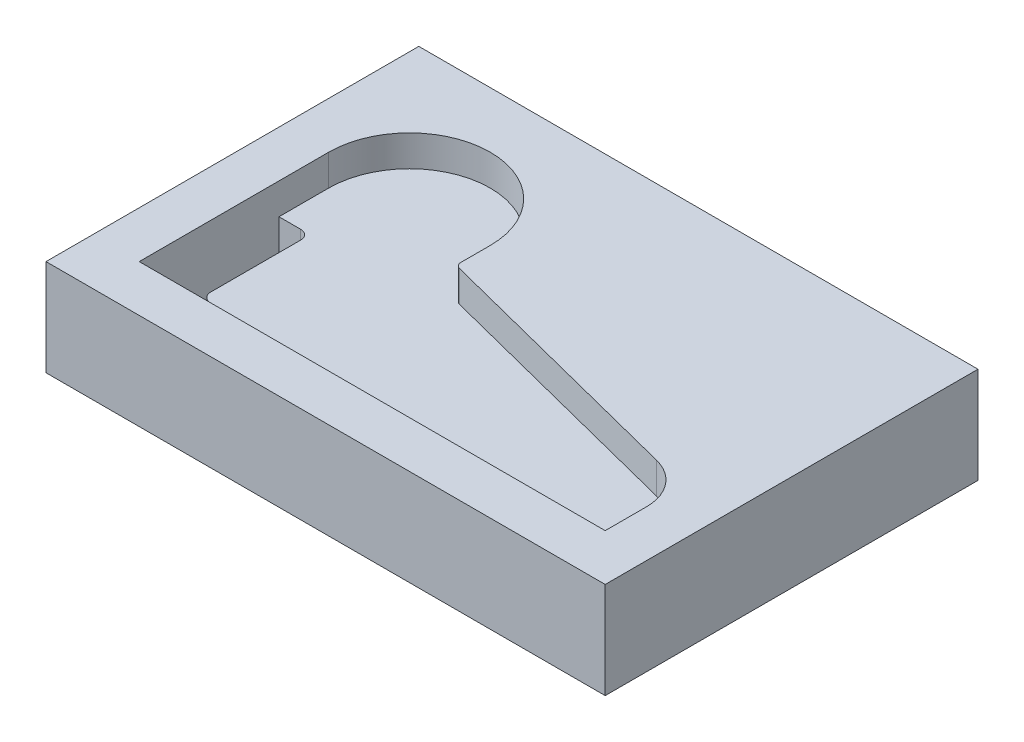
ISO-10303-21;
HEADER;
FILE_DESCRIPTION(('STEP AP214'),'2;1');
FILE_NAME('part.step','',(''),(''),'','','');
FILE_SCHEMA(('AUTOMOTIVE_DESIGN { 1 0 10303 214 1 1 1 1 }'));
ENDSEC;
DATA;
#1=APPLICATION_CONTEXT('core data for automotive mechanical design processes');
#2=APPLICATION_PROTOCOL_DEFINITION('international standard','automotive_design',2000,#1);
#3=PRODUCT_CONTEXT('',#1,'mechanical');
#4=PRODUCT('Part','Part','',(#3));
#5=PRODUCT_RELATED_PRODUCT_CATEGORY('part','',(#4));
#6=PRODUCT_DEFINITION_FORMATION('','',#4);
#7=PRODUCT_DEFINITION_CONTEXT('part definition',#1,'design');
#8=PRODUCT_DEFINITION('design','',#6,#7);
#9=PRODUCT_DEFINITION_SHAPE('','',#8);
#10=(LENGTH_UNIT() NAMED_UNIT(*) SI_UNIT(.MILLI.,.METRE.));
#11=(NAMED_UNIT(*) PLANE_ANGLE_UNIT() SI_UNIT($,.RADIAN.));
#12=(NAMED_UNIT(*) SI_UNIT($,.STERADIAN.) SOLID_ANGLE_UNIT());
#13=UNCERTAINTY_MEASURE_WITH_UNIT(LENGTH_MEASURE(1.E-05),#10,'distance_accuracy_value','');
#14=(GEOMETRIC_REPRESENTATION_CONTEXT(3) GLOBAL_UNCERTAINTY_ASSIGNED_CONTEXT((#13)) GLOBAL_UNIT_ASSIGNED_CONTEXT((#10,
#11,#12)) REPRESENTATION_CONTEXT('',''));
#15=CARTESIAN_POINT('',(0.,0.,0.));
#16=DIRECTION('',(0.,0.,1.));
#17=DIRECTION('',(1.,0.,0.));
#18=AXIS2_PLACEMENT_3D('',#15,#16,#17);
#19=CARTESIAN_POINT('',(90.,40.,60.));
#20=DIRECTION('',(-1.,0.,0.));
#21=DIRECTION('',(0.,0.,1.));
#22=AXIS2_PLACEMENT_3D('',#19,#20,#21);
#23=PLANE('',#22);
#24=DIRECTION('',(0.,0.,1.));
#25=VECTOR('',#24,1.);
#26=CARTESIAN_POINT('',(90.,9.,60.));
#27=LINE('',#26,#25);
#28=CARTESIAN_POINT('',(90.,9.,-60.));
#29=VERTEX_POINT('',#28);
#30=CARTESIAN_POINT('',(90.,9.,60.));
#31=VERTEX_POINT('',#30);
#32=EDGE_CURVE('E61',#29,#31,#27,.T.);
#33=ORIENTED_EDGE('',*,*,#32,.F.);
#34=DIRECTION('',(0.,-1.,0.));
#35=VECTOR('',#34,1.);
#36=CARTESIAN_POINT('',(90.,40.,-60.));
#37=LINE('',#36,#35);
#38=CARTESIAN_POINT('',(90.,40.,-60.));
#39=VERTEX_POINT('',#38);
#40=EDGE_CURVE('E11',#39,#29,#37,.T.);
#41=ORIENTED_EDGE('',*,*,#40,.F.);
#42=DIRECTION('',(0.,0.,-1.));
#43=VECTOR('',#42,1.);
#44=CARTESIAN_POINT('',(90.,40.,60.));
#45=LINE('',#44,#43);
#46=CARTESIAN_POINT('',(90.,40.,60.));
#47=VERTEX_POINT('',#46);
#48=EDGE_CURVE('E200',#47,#39,#45,.T.);
#49=ORIENTED_EDGE('',*,*,#48,.F.);
#50=DIRECTION('',(0.,-1.,0.));
#51=VECTOR('',#50,1.);
#52=CARTESIAN_POINT('',(90.,40.,60.));
#53=LINE('',#52,#51);
#54=EDGE_CURVE('E190',#47,#31,#53,.T.);
#55=ORIENTED_EDGE('',*,*,#54,.T.);
#56=EDGE_LOOP('',(#33,#41,#49,#55));
#57=FACE_BOUND('',#56,.T.);
#58=ADVANCED_FACE('F47',(#57),#23,.F.);
#59=CARTESIAN_POINT('',(-90.,40.,-60.));
#60=DIRECTION('',(0.,0.,1.));
#61=DIRECTION('',(1.,0.,0.));
#62=AXIS2_PLACEMENT_3D('',#59,#60,#61);
#63=PLANE('',#62);
#64=DIRECTION('',(1.,0.,0.));
#65=VECTOR('',#64,1.);
#66=CARTESIAN_POINT('',(-90.,9.,-60.));
#67=LINE('',#66,#65);
#68=CARTESIAN_POINT('',(-90.,9.,-60.));
#69=VERTEX_POINT('',#68);
#70=EDGE_CURVE('E174',#69,#29,#67,.T.);
#71=ORIENTED_EDGE('',*,*,#70,.F.);
#72=DIRECTION('',(0.,-1.,0.));
#73=VECTOR('',#72,1.);
#74=CARTESIAN_POINT('',(-90.,40.,-60.));
#75=LINE('',#74,#73);
#76=CARTESIAN_POINT('',(-90.,40.,-60.));
#77=VERTEX_POINT('',#76);
#78=EDGE_CURVE('E54',#77,#69,#75,.T.);
#79=ORIENTED_EDGE('',*,*,#78,.F.);
#80=DIRECTION('',(-1.,0.,0.));
#81=VECTOR('',#80,1.);
#82=CARTESIAN_POINT('',(-90.,40.,-60.));
#83=LINE('',#82,#81);
#84=EDGE_CURVE('E198',#39,#77,#83,.T.);
#85=ORIENTED_EDGE('',*,*,#84,.F.);
#86=ORIENTED_EDGE('',*,*,#40,.T.);
#87=EDGE_LOOP('',(#71,#79,#85,#86));
#88=FACE_BOUND('',#87,.T.);
#89=ADVANCED_FACE('F183',(#88),#63,.F.);
#90=CARTESIAN_POINT('',(-90.,40.,60.));
#91=DIRECTION('',(1.,0.,0.));
#92=DIRECTION('',(0.,0.,-1.));
#93=AXIS2_PLACEMENT_3D('',#90,#91,#92);
#94=PLANE('',#93);
#95=DIRECTION('',(0.,0.,-1.));
#96=VECTOR('',#95,1.);
#97=CARTESIAN_POINT('',(-90.,9.,60.));
#98=LINE('',#97,#96);
#99=CARTESIAN_POINT('',(-90.,9.,60.));
#100=VERTEX_POINT('',#99);
#101=EDGE_CURVE('E171',#100,#69,#98,.T.);
#102=ORIENTED_EDGE('',*,*,#101,.F.);
#103=DIRECTION('',(0.,-1.,0.));
#104=VECTOR('',#103,1.);
#105=CARTESIAN_POINT('',(-90.,40.,60.));
#106=LINE('',#105,#104);
#107=CARTESIAN_POINT('',(-90.,40.,60.));
#108=VERTEX_POINT('',#107);
#109=EDGE_CURVE('E189',#108,#100,#106,.T.);
#110=ORIENTED_EDGE('',*,*,#109,.F.);
#111=DIRECTION('',(0.,0.,1.));
#112=VECTOR('',#111,1.);
#113=CARTESIAN_POINT('',(-90.,40.,60.));
#114=LINE('',#113,#112);
#115=EDGE_CURVE('E188',#77,#108,#114,.T.);
#116=ORIENTED_EDGE('',*,*,#115,.F.);
#117=ORIENTED_EDGE('',*,*,#78,.T.);
#118=EDGE_LOOP('',(#102,#110,#116,#117));
#119=FACE_BOUND('',#118,.T.);
#120=ADVANCED_FACE('F187',(#119),#94,.F.);
#121=CARTESIAN_POINT('',(-90.,40.,60.));
#122=DIRECTION('',(0.,0.,-1.));
#123=DIRECTION('',(-1.,0.,0.));
#124=AXIS2_PLACEMENT_3D('',#121,#122,#123);
#125=PLANE('',#124);
#126=DIRECTION('',(-1.,0.,0.));
#127=VECTOR('',#126,1.);
#128=CARTESIAN_POINT('',(-90.,9.,60.));
#129=LINE('',#128,#127);
#130=EDGE_CURVE('E175',#31,#100,#129,.T.);
#131=ORIENTED_EDGE('',*,*,#130,.F.);
#132=ORIENTED_EDGE('',*,*,#54,.F.);
#133=DIRECTION('',(1.,0.,0.));
#134=VECTOR('',#133,1.);
#135=CARTESIAN_POINT('',(-90.,40.,60.));
#136=LINE('',#135,#134);
#137=EDGE_CURVE('E195',#108,#47,#136,.T.);
#138=ORIENTED_EDGE('',*,*,#137,.F.);
#139=ORIENTED_EDGE('',*,*,#109,.T.);
#140=EDGE_LOOP('',(#131,#132,#138,#139));
#141=FACE_BOUND('',#140,.T.);
#142=ADVANCED_FACE('F387',(#141),#125,.F.);
#143=CARTESIAN_POINT('',(0.,40.,0.));
#144=DIRECTION('',(0.,-1.,0.));
#145=DIRECTION('',(0.,0.,-1.));
#146=AXIS2_PLACEMENT_3D('',#143,#144,#145);
#147=PLANE('',#146);
#148=ORIENTED_EDGE('',*,*,#48,.T.);
#149=ORIENTED_EDGE('',*,*,#84,.T.);
#150=ORIENTED_EDGE('',*,*,#115,.T.);
#151=ORIENTED_EDGE('',*,*,#137,.T.);
#152=EDGE_LOOP('',(#148,#149,#150,#151));
#153=FACE_BOUND('',#152,.T.);
#154=DIRECTION('',(0.,0.,1.));
#155=VECTOR('',#154,1.);
#156=CARTESIAN_POINT('',(75.,40.,20.));
#157=LINE('',#156,#155);
#158=CARTESIAN_POINT('',(75.,40.,31.6538549296738));
#159=VERTEX_POINT('',#158);
#160=CARTESIAN_POINT('',(75.,40.,45.));
#161=VERTEX_POINT('',#160);
#162=EDGE_CURVE('E297',#159,#161,#157,.T.);
#163=ORIENTED_EDGE('',*,*,#162,.T.);
#164=DIRECTION('',(-1.,0.,0.));
#165=VECTOR('',#164,1.);
#166=CARTESIAN_POINT('',(0.,40.,45.));
#167=LINE('',#166,#165);
#168=CARTESIAN_POINT('',(-75.,40.,45.));
#169=VERTEX_POINT('',#168);
#170=EDGE_CURVE('E304',#161,#169,#167,.T.);
#171=ORIENTED_EDGE('',*,*,#170,.T.);
#172=DIRECTION('',(0.,0.,1.));
#173=VECTOR('',#172,1.);
#174=CARTESIAN_POINT('',(-75.,40.,0.));
#175=LINE('',#174,#173);
#176=CARTESIAN_POINT('',(-75.,40.,-16.));
#177=VERTEX_POINT('',#176);
#178=EDGE_CURVE('E290',#177,#169,#175,.T.);
#179=ORIENTED_EDGE('',*,*,#178,.F.);
#180=CARTESIAN_POINT('',(-49.,40.,-16.));
#181=DIRECTION('',(0.,1.,0.));
#182=DIRECTION('',(0.,0.,1.));
#183=AXIS2_PLACEMENT_3D('',#180,#181,#182);
#184=CIRCLE('',#183,26.);
#185=CARTESIAN_POINT('',(-23.,40.,-16.));
#186=VERTEX_POINT('',#185);
#187=EDGE_CURVE('E243',#186,#177,#184,.T.);
#188=ORIENTED_EDGE('',*,*,#187,.F.);
#189=DIRECTION('',(0.,0.,1.));
#190=VECTOR('',#189,1.);
#191=CARTESIAN_POINT('',(-23.,40.,0.));
#192=LINE('',#191,#190);
#193=CARTESIAN_POINT('',(-23.,40.,-6.55384732395653));
#194=VERTEX_POINT('',#193);
#195=EDGE_CURVE('E294',#186,#194,#192,.T.);
#196=ORIENTED_EDGE('',*,*,#195,.T.);
#197=CARTESIAN_POINT('',(-21.,40.,-6.55384732395653));
#198=DIRECTION('',(0.,1.,0.));
#199=DIRECTION('',(0.,0.,1.));
#200=AXIS2_PLACEMENT_3D('',#197,#198,#199);
#201=CIRCLE('',#200,2.);
#202=CARTESIAN_POINT('',(-21.4943714873099,40.,-4.61591109370153));
#203=VERTEX_POINT('',#202);
#204=EDGE_CURVE('E203',#203,#194,#201,.F.);
#205=ORIENTED_EDGE('',*,*,#204,.F.);
#206=DIRECTION('',(0.968968115127499,0.,0.247185743654974));
#207=VECTOR('',#206,1.);
#208=CARTESIAN_POINT('',(-23.,40.,-5.00000000000001));
#209=LINE('',#208,#207);
#210=CARTESIAN_POINT('',(63.7077861548246,40.,17.1193332027614));
#211=VERTEX_POINT('',#210);
#212=EDGE_CURVE('E69',#203,#211,#209,.T.);
#213=ORIENTED_EDGE('',*,*,#212,.T.);
#214=CARTESIAN_POINT('',(60.,40.,31.6538549296738));
#215=DIRECTION('',(0.,1.,0.));
#216=DIRECTION('',(0.,0.,1.));
#217=AXIS2_PLACEMENT_3D('',#214,#215,#216);
#218=CIRCLE('',#217,15.);
#219=EDGE_CURVE('E234',#159,#211,#218,.T.);
#220=ORIENTED_EDGE('',*,*,#219,.F.);
#221=EDGE_LOOP('',(#163,#171,#179,#188,#196,#205,#213,#220));
#222=FACE_BOUND('',#221,.T.);
#223=ADVANCED_FACE('F312',(#153,#222),#147,.F.);
#224=CARTESIAN_POINT('',(-75.,91.,35.));
#225=DIRECTION('',(1.,0.,0.));
#226=DIRECTION('',(0.,-1.,0.));
#227=AXIS2_PLACEMENT_3D('',#224,#225,#226);
#228=PLANE('',#227);
#229=DIRECTION('',(0.,1.,0.));
#230=VECTOR('',#229,1.);
#231=CARTESIAN_POINT('',(-75.,91.,45.));
#232=LINE('',#231,#230);
#233=CARTESIAN_POINT('',(-75.,9.00000000000001,45.));
#234=VERTEX_POINT('',#233);
#235=EDGE_CURVE('E265',#234,#169,#232,.T.);
#236=ORIENTED_EDGE('',*,*,#235,.F.);
#237=DIRECTION('',(0.,0.,1.));
#238=VECTOR('',#237,1.);
#239=CARTESIAN_POINT('',(-75.,9.00000000000001,35.));
#240=LINE('',#239,#238);
#241=CARTESIAN_POINT('',(-75.,9.00000000000001,0.));
#242=VERTEX_POINT('',#241);
#243=EDGE_CURVE('E255',#242,#234,#240,.T.);
#244=ORIENTED_EDGE('',*,*,#243,.F.);
#245=DIRECTION('',(0.,-1.,0.));
#246=VECTOR('',#245,1.);
#247=CARTESIAN_POINT('',(-75.,91.,0.));
#248=LINE('',#247,#246);
#249=CARTESIAN_POINT('',(-75.,30.,0.));
#250=VERTEX_POINT('',#249);
#251=EDGE_CURVE('E271',#250,#242,#248,.T.);
#252=ORIENTED_EDGE('',*,*,#251,.F.);
#253=DIRECTION('',(0.,0.,-1.));
#254=VECTOR('',#253,1.);
#255=CARTESIAN_POINT('',(-75.,30.,0.));
#256=LINE('',#255,#254);
#257=CARTESIAN_POINT('',(-75.,30.,-16.));
#258=VERTEX_POINT('',#257);
#259=EDGE_CURVE('E287',#250,#258,#256,.T.);
#260=ORIENTED_EDGE('',*,*,#259,.T.);
#261=DIRECTION('',(0.,-1.,0.));
#262=VECTOR('',#261,1.);
#263=CARTESIAN_POINT('',(-75.,30.,-16.));
#264=LINE('',#263,#262);
#265=EDGE_CURVE('E248',#177,#258,#264,.T.);
#266=ORIENTED_EDGE('',*,*,#265,.F.);
#267=ORIENTED_EDGE('',*,*,#178,.T.);
#268=EDGE_LOOP('',(#236,#244,#252,#260,#266,#267));
#269=FACE_BOUND('',#268,.T.);
#270=ADVANCED_FACE('F328',(#269),#228,.T.);
#271=CARTESIAN_POINT('',(75.,91.,35.));
#272=DIRECTION('',(-1.,0.,0.));
#273=DIRECTION('',(0.,1.,0.));
#274=AXIS2_PLACEMENT_3D('',#271,#272,#273);
#275=PLANE('',#274);
#276=ORIENTED_EDGE('',*,*,#162,.F.);
#277=DIRECTION('',(0.,-1.,0.));
#278=VECTOR('',#277,1.);
#279=CARTESIAN_POINT('',(75.,40.,31.6538549296738));
#280=LINE('',#279,#278);
#281=CARTESIAN_POINT('',(75.,30.,31.6538549296738));
#282=VERTEX_POINT('',#281);
#283=EDGE_CURVE('E236',#282,#159,#280,.F.);
#284=ORIENTED_EDGE('',*,*,#283,.F.);
#285=DIRECTION('',(0.,0.,1.));
#286=VECTOR('',#285,1.);
#287=CARTESIAN_POINT('',(75.,30.,20.));
#288=LINE('',#287,#286);
#289=CARTESIAN_POINT('',(75.,30.,35.));
#290=VERTEX_POINT('',#289);
#291=EDGE_CURVE('E299',#282,#290,#288,.T.);
#292=ORIENTED_EDGE('',*,*,#291,.T.);
#293=DIRECTION('',(0.,-1.,0.));
#294=VECTOR('',#293,1.);
#295=CARTESIAN_POINT('',(75.,91.,35.));
#296=LINE('',#295,#294);
#297=CARTESIAN_POINT('',(75.,9.00000000000001,35.));
#298=VERTEX_POINT('',#297);
#299=EDGE_CURVE('E260',#290,#298,#296,.T.);
#300=ORIENTED_EDGE('',*,*,#299,.T.);
#301=DIRECTION('',(0.,0.,1.));
#302=VECTOR('',#301,1.);
#303=CARTESIAN_POINT('',(75.,9.00000000000001,35.));
#304=LINE('',#303,#302);
#305=CARTESIAN_POINT('',(75.,9.00000000000001,45.));
#306=VERTEX_POINT('',#305);
#307=EDGE_CURVE('E257',#298,#306,#304,.T.);
#308=ORIENTED_EDGE('',*,*,#307,.T.);
#309=DIRECTION('',(0.,-1.,0.));
#310=VECTOR('',#309,1.);
#311=CARTESIAN_POINT('',(75.,91.,45.));
#312=LINE('',#311,#310);
#313=EDGE_CURVE('E261',#161,#306,#312,.T.);
#314=ORIENTED_EDGE('',*,*,#313,.F.);
#315=EDGE_LOOP('',(#276,#284,#292,#300,#308,#314));
#316=FACE_BOUND('',#315,.T.);
#317=ADVANCED_FACE('F321',(#316),#275,.T.);
#318=CARTESIAN_POINT('',(0.,50.,45.));
#319=DIRECTION('',(0.,0.,1.));
#320=DIRECTION('',(-1.,0.,0.));
#321=AXIS2_PLACEMENT_3D('',#318,#319,#320);
#322=PLANE('',#321);
#323=ORIENTED_EDGE('',*,*,#313,.T.);
#324=DIRECTION('',(-1.,0.,0.));
#325=VECTOR('',#324,1.);
#326=CARTESIAN_POINT('',(75.,9.00000000000001,45.));
#327=LINE('',#326,#325);
#328=EDGE_CURVE('E268',#306,#234,#327,.T.);
#329=ORIENTED_EDGE('',*,*,#328,.T.);
#330=ORIENTED_EDGE('',*,*,#235,.T.);
#331=ORIENTED_EDGE('',*,*,#170,.F.);
#332=EDGE_LOOP('',(#323,#329,#330,#331));
#333=FACE_BOUND('',#332,.T.);
#334=ADVANCED_FACE('F318',(#333),#322,.F.);
#335=CARTESIAN_POINT('',(-49.,30.,-16.));
#336=DIRECTION('',(0.,1.,0.));
#337=DIRECTION('',(1.,0.,0.));
#338=AXIS2_PLACEMENT_3D('',#335,#336,#337);
#339=CYLINDRICAL_SURFACE('',#338,26.);
#340=DIRECTION('',(0.,-1.,0.));
#341=VECTOR('',#340,1.);
#342=CARTESIAN_POINT('',(-23.,30.,-16.));
#343=LINE('',#342,#341);
#344=CARTESIAN_POINT('',(-23.,30.,-16.));
#345=VERTEX_POINT('',#344);
#346=EDGE_CURVE('E251',#345,#186,#343,.F.);
#347=ORIENTED_EDGE('',*,*,#346,.T.);
#348=ORIENTED_EDGE('',*,*,#187,.T.);
#349=ORIENTED_EDGE('',*,*,#265,.T.);
#350=CARTESIAN_POINT('',(-49.,30.,-16.));
#351=DIRECTION('',(0.,-1.,0.));
#352=DIRECTION('',(-1.,0.,0.));
#353=AXIS2_PLACEMENT_3D('',#350,#351,#352);
#354=CIRCLE('',#353,26.);
#355=EDGE_CURVE('E245',#258,#345,#354,.T.);
#356=ORIENTED_EDGE('',*,*,#355,.T.);
#357=EDGE_LOOP('',(#347,#348,#349,#356));
#358=FACE_BOUND('',#357,.T.);
#359=ADVANCED_FACE('F333',(#358),#339,.F.);
#360=CARTESIAN_POINT('',(-65.,91.,45.));
#361=DIRECTION('',(1.,0.,0.));
#362=DIRECTION('',(0.,-1.,0.));
#363=AXIS2_PLACEMENT_3D('',#360,#361,#362);
#364=PLANE('',#363);
#365=DIRECTION('',(0.,0.,-1.));
#366=VECTOR('',#365,1.);
#367=CARTESIAN_POINT('',(-65.,30.,45.));
#368=LINE('',#367,#366);
#369=CARTESIAN_POINT('',(-65.,30.,32.));
#370=VERTEX_POINT('',#369);
#371=CARTESIAN_POINT('',(-65.,30.,2.99999999999999));
#372=VERTEX_POINT('',#371);
#373=EDGE_CURVE('E283',#370,#372,#368,.T.);
#374=ORIENTED_EDGE('',*,*,#373,.T.);
#375=DIRECTION('',(0.,-1.,0.));
#376=VECTOR('',#375,1.);
#377=CARTESIAN_POINT('',(-65.,91.,2.99999999999999));
#378=LINE('',#377,#376);
#379=CARTESIAN_POINT('',(-65.,9.00000000000001,3.00000000000001));
#380=VERTEX_POINT('',#379);
#381=EDGE_CURVE('E225',#380,#372,#378,.F.);
#382=ORIENTED_EDGE('',*,*,#381,.F.);
#383=DIRECTION('',(0.,0.,1.));
#384=VECTOR('',#383,1.);
#385=CARTESIAN_POINT('',(-65.,9.00000000000001,45.));
#386=LINE('',#385,#384);
#387=CARTESIAN_POINT('',(-65.,9.00000000000001,32.));
#388=VERTEX_POINT('',#387);
#389=EDGE_CURVE('E277',#380,#388,#386,.T.);
#390=ORIENTED_EDGE('',*,*,#389,.T.);
#391=DIRECTION('',(0.,1.,0.));
#392=VECTOR('',#391,1.);
#393=CARTESIAN_POINT('',(-65.,91.,32.));
#394=LINE('',#393,#392);
#395=EDGE_CURVE('E215',#370,#388,#394,.F.);
#396=ORIENTED_EDGE('',*,*,#395,.F.);
#397=EDGE_LOOP('',(#374,#382,#390,#396));
#398=FACE_BOUND('',#397,.T.);
#399=ADVANCED_FACE('F365',(#398),#364,.F.);
#400=CARTESIAN_POINT('',(-75.,91.,0.));
#401=DIRECTION('',(0.,0.,-1.));
#402=DIRECTION('',(1.,0.,0.));
#403=AXIS2_PLACEMENT_3D('',#400,#401,#402);
#404=PLANE('',#403);
#405=DIRECTION('',(-1.,0.,0.));
#406=VECTOR('',#405,1.);
#407=CARTESIAN_POINT('',(-75.,30.,0.));
#408=LINE('',#407,#406);
#409=CARTESIAN_POINT('',(-68.,30.,0.));
#410=VERTEX_POINT('',#409);
#411=EDGE_CURVE('E253',#410,#250,#408,.T.);
#412=ORIENTED_EDGE('',*,*,#411,.T.);
#413=ORIENTED_EDGE('',*,*,#251,.T.);
#414=DIRECTION('',(1.,0.,0.));
#415=VECTOR('',#414,1.);
#416=CARTESIAN_POINT('',(-75.,9.00000000000001,0.));
#417=LINE('',#416,#415);
#418=CARTESIAN_POINT('',(-68.,9.00000000000001,0.));
#419=VERTEX_POINT('',#418);
#420=EDGE_CURVE('E280',#242,#419,#417,.T.);
#421=ORIENTED_EDGE('',*,*,#420,.T.);
#422=DIRECTION('',(0.,-1.,0.));
#423=VECTOR('',#422,1.);
#424=CARTESIAN_POINT('',(-68.,91.,0.));
#425=LINE('',#424,#423);
#426=EDGE_CURVE('E231',#410,#419,#425,.T.);
#427=ORIENTED_EDGE('',*,*,#426,.F.);
#428=EDGE_LOOP('',(#412,#413,#421,#427));
#429=FACE_BOUND('',#428,.T.);
#430=ADVANCED_FACE('F368',(#429),#404,.F.);
#431=CARTESIAN_POINT('',(0.,50.,35.));
#432=DIRECTION('',(0.,0.,1.));
#433=DIRECTION('',(-1.,0.,0.));
#434=AXIS2_PLACEMENT_3D('',#431,#432,#433);
#435=PLANE('',#434);
#436=DIRECTION('',(-1.,0.,0.));
#437=VECTOR('',#436,1.);
#438=CARTESIAN_POINT('',(75.,9.00000000000001,35.));
#439=LINE('',#438,#437);
#440=CARTESIAN_POINT('',(-62.,9.00000000000001,35.));
#441=VERTEX_POINT('',#440);
#442=EDGE_CURVE('E264',#298,#441,#439,.T.);
#443=ORIENTED_EDGE('',*,*,#442,.F.);
#444=ORIENTED_EDGE('',*,*,#299,.F.);
#445=DIRECTION('',(1.,0.,0.));
#446=VECTOR('',#445,1.);
#447=CARTESIAN_POINT('',(-75.,30.,35.));
#448=LINE('',#447,#446);
#449=CARTESIAN_POINT('',(-62.,30.,35.));
#450=VERTEX_POINT('',#449);
#451=EDGE_CURVE('E285',#450,#290,#448,.T.);
#452=ORIENTED_EDGE('',*,*,#451,.F.);
#453=DIRECTION('',(0.,1.,0.));
#454=VECTOR('',#453,1.);
#455=CARTESIAN_POINT('',(-62.,50.,35.));
#456=LINE('',#455,#454);
#457=EDGE_CURVE('E220',#441,#450,#456,.T.);
#458=ORIENTED_EDGE('',*,*,#457,.F.);
#459=EDGE_LOOP('',(#443,#444,#452,#458));
#460=FACE_BOUND('',#459,.T.);
#461=ADVANCED_FACE('F353',(#460),#435,.T.);
#462=CARTESIAN_POINT('',(-75.,30.,0.));
#463=DIRECTION('',(0.,-1.,0.));
#464=DIRECTION('',(-1.,0.,0.));
#465=AXIS2_PLACEMENT_3D('',#462,#463,#464);
#466=PLANE('',#465);
#467=ORIENTED_EDGE('',*,*,#291,.F.);
#468=CARTESIAN_POINT('',(60.,30.,31.6538549296738));
#469=DIRECTION('',(0.,-1.,0.));
#470=DIRECTION('',(-1.,0.,0.));
#471=AXIS2_PLACEMENT_3D('',#468,#469,#470);
#472=CIRCLE('',#471,15.);
#473=CARTESIAN_POINT('',(63.7077861548246,30.,17.1193332027614));
#474=VERTEX_POINT('',#473);
#475=EDGE_CURVE('E238',#474,#282,#472,.T.);
#476=ORIENTED_EDGE('',*,*,#475,.F.);
#477=DIRECTION('',(0.968968115127499,0.,0.247185743654974));
#478=VECTOR('',#477,1.);
#479=CARTESIAN_POINT('',(-23.,30.,-5.00000000000001));
#480=LINE('',#479,#478);
#481=CARTESIAN_POINT('',(-21.4943714873099,30.,-4.61591109370152));
#482=VERTEX_POINT('',#481);
#483=EDGE_CURVE('E302',#482,#474,#480,.T.);
#484=ORIENTED_EDGE('',*,*,#483,.F.);
#485=CARTESIAN_POINT('',(-21.,30.,-6.55384732395653));
#486=DIRECTION('',(0.,-1.,0.));
#487=DIRECTION('',(-1.,0.,0.));
#488=AXIS2_PLACEMENT_3D('',#485,#486,#487);
#489=CIRCLE('',#488,2.);
#490=CARTESIAN_POINT('',(-23.,30.,-6.55384732395653));
#491=VERTEX_POINT('',#490);
#492=EDGE_CURVE('E205',#491,#482,#489,.F.);
#493=ORIENTED_EDGE('',*,*,#492,.F.);
#494=DIRECTION('',(0.,0.,-1.));
#495=VECTOR('',#494,1.);
#496=CARTESIAN_POINT('',(-23.,30.,0.));
#497=LINE('',#496,#495);
#498=EDGE_CURVE('E292',#491,#345,#497,.T.);
#499=ORIENTED_EDGE('',*,*,#498,.T.);
#500=ORIENTED_EDGE('',*,*,#355,.F.);
#501=ORIENTED_EDGE('',*,*,#259,.F.);
#502=ORIENTED_EDGE('',*,*,#411,.F.);
#503=CARTESIAN_POINT('',(-68.,30.,2.99999999999999));
#504=DIRECTION('',(0.,-1.,0.));
#505=DIRECTION('',(-1.,0.,0.));
#506=AXIS2_PLACEMENT_3D('',#503,#504,#505);
#507=CIRCLE('',#506,3.);
#508=EDGE_CURVE('E223',#372,#410,#507,.F.);
#509=ORIENTED_EDGE('',*,*,#508,.F.);
#510=ORIENTED_EDGE('',*,*,#373,.F.);
#511=CARTESIAN_POINT('',(-62.,30.,32.));
#512=DIRECTION('',(0.,-1.,0.));
#513=DIRECTION('',(-1.,0.,0.));
#514=AXIS2_PLACEMENT_3D('',#511,#512,#513);
#515=CIRCLE('',#514,3.);
#516=EDGE_CURVE('E218',#450,#370,#515,.T.);
#517=ORIENTED_EDGE('',*,*,#516,.F.);
#518=ORIENTED_EDGE('',*,*,#451,.T.);
#519=EDGE_LOOP('',(#467,#476,#484,#493,#499,#500,#501,#502,#509,#510,#517,#518));
#520=FACE_BOUND('',#519,.T.);
#521=ADVANCED_FACE('F348',(#520),#466,.F.);
#522=CARTESIAN_POINT('',(-23.,50.,45.));
#523=DIRECTION('',(-1.,0.,0.));
#524=DIRECTION('',(0.,1.,0.));
#525=AXIS2_PLACEMENT_3D('',#522,#523,#524);
#526=PLANE('',#525);
#527=ORIENTED_EDGE('',*,*,#195,.F.);
#528=ORIENTED_EDGE('',*,*,#346,.F.);
#529=ORIENTED_EDGE('',*,*,#498,.F.);
#530=DIRECTION('',(0.,-1.,0.));
#531=VECTOR('',#530,1.);
#532=CARTESIAN_POINT('',(-23.,50.,-6.55384732395653));
#533=LINE('',#532,#531);
#534=EDGE_CURVE('E209',#194,#491,#533,.T.);
#535=ORIENTED_EDGE('',*,*,#534,.F.);
#536=EDGE_LOOP('',(#527,#528,#529,#535));
#537=FACE_BOUND('',#536,.T.);
#538=ADVANCED_FACE('F339',(#537),#526,.T.);
#539=CARTESIAN_POINT('',(-23.,145.848948979194,-5.00000000000001));
#540=DIRECTION('',(0.247185743654974,0.,-0.968968115127499));
#541=DIRECTION('',(0.968968115127499,0.,0.247185743654974));
#542=AXIS2_PLACEMENT_3D('',#539,#540,#541);
#543=PLANE('',#542);
#544=ORIENTED_EDGE('',*,*,#483,.T.);
#545=DIRECTION('',(0.,-1.,0.));
#546=VECTOR('',#545,1.);
#547=CARTESIAN_POINT('',(63.7077861548246,30.,17.1193332027614));
#548=LINE('',#547,#546);
#549=EDGE_CURVE('E240',#211,#474,#548,.T.);
#550=ORIENTED_EDGE('',*,*,#549,.F.);
#551=ORIENTED_EDGE('',*,*,#212,.F.);
#552=DIRECTION('',(0.,-1.,0.));
#553=VECTOR('',#552,1.);
#554=CARTESIAN_POINT('',(-21.4943714873099,145.848948979194,-4.61591109370152));
#555=LINE('',#554,#553);
#556=EDGE_CURVE('E207',#482,#203,#555,.F.);
#557=ORIENTED_EDGE('',*,*,#556,.F.);
#558=EDGE_LOOP('',(#544,#550,#551,#557));
#559=FACE_BOUND('',#558,.T.);
#560=ADVANCED_FACE('F344',(#559),#543,.F.);
#561=CARTESIAN_POINT('',(60.,145.848948979194,31.6538549296738));
#562=DIRECTION('',(0.,1.,0.));
#563=DIRECTION('',(1.,0.,0.));
#564=AXIS2_PLACEMENT_3D('',#561,#562,#563);
#565=CYLINDRICAL_SURFACE('',#564,15.);
#566=ORIENTED_EDGE('',*,*,#219,.T.);
#567=ORIENTED_EDGE('',*,*,#549,.T.);
#568=ORIENTED_EDGE('',*,*,#475,.T.);
#569=ORIENTED_EDGE('',*,*,#283,.T.);
#570=EDGE_LOOP('',(#566,#567,#568,#569));
#571=FACE_BOUND('',#570,.T.);
#572=ADVANCED_FACE('F350',(#571),#565,.F.);
#573=CARTESIAN_POINT('',(-68.,91.,2.99999999999999));
#574=DIRECTION('',(0.,-1.,0.));
#575=DIRECTION('',(-1.,0.,0.));
#576=AXIS2_PLACEMENT_3D('',#573,#574,#575);
#577=CYLINDRICAL_SURFACE('',#576,3.);
#578=ORIENTED_EDGE('',*,*,#508,.T.);
#579=ORIENTED_EDGE('',*,*,#426,.T.);
#580=CARTESIAN_POINT('',(-68.,9.00000000000001,2.99999999999999));
#581=DIRECTION('',(0.,1.,0.));
#582=DIRECTION('',(1.,0.,0.));
#583=AXIS2_PLACEMENT_3D('',#580,#581,#582);
#584=CIRCLE('',#583,3.);
#585=EDGE_CURVE('E228',#419,#380,#584,.F.);
#586=ORIENTED_EDGE('',*,*,#585,.T.);
#587=ORIENTED_EDGE('',*,*,#381,.T.);
#588=EDGE_LOOP('',(#578,#579,#586,#587));
#589=FACE_BOUND('',#588,.T.);
#590=ADVANCED_FACE('F362',(#589),#577,.F.);
#591=CARTESIAN_POINT('',(-62.,50.,32.));
#592=DIRECTION('',(0.,1.,0.));
#593=DIRECTION('',(1.,0.,0.));
#594=AXIS2_PLACEMENT_3D('',#591,#592,#593);
#595=CYLINDRICAL_SURFACE('',#594,3.);
#596=CARTESIAN_POINT('',(-62.,9.00000000000001,32.));
#597=DIRECTION('',(0.,1.,0.));
#598=DIRECTION('',(1.,0.,0.));
#599=AXIS2_PLACEMENT_3D('',#596,#597,#598);
#600=CIRCLE('',#599,3.);
#601=EDGE_CURVE('E212',#388,#441,#600,.T.);
#602=ORIENTED_EDGE('',*,*,#601,.T.);
#603=ORIENTED_EDGE('',*,*,#457,.T.);
#604=ORIENTED_EDGE('',*,*,#516,.T.);
#605=ORIENTED_EDGE('',*,*,#395,.T.);
#606=EDGE_LOOP('',(#602,#603,#604,#605));
#607=FACE_BOUND('',#606,.T.);
#608=ADVANCED_FACE('F356',(#607),#595,.T.);
#609=CARTESIAN_POINT('',(-21.,50.,-6.55384732395653));
#610=DIRECTION('',(0.,-1.,0.));
#611=DIRECTION('',(-1.,0.,0.));
#612=AXIS2_PLACEMENT_3D('',#609,#610,#611);
#613=CYLINDRICAL_SURFACE('',#612,2.);
#614=ORIENTED_EDGE('',*,*,#204,.T.);
#615=ORIENTED_EDGE('',*,*,#534,.T.);
#616=ORIENTED_EDGE('',*,*,#492,.T.);
#617=ORIENTED_EDGE('',*,*,#556,.T.);
#618=EDGE_LOOP('',(#614,#615,#616,#617));
#619=FACE_BOUND('',#618,.T.);
#620=ADVANCED_FACE('F342',(#619),#613,.T.);
#621=CARTESIAN_POINT('',(0.,9.,0.));
#622=DIRECTION('',(0.,-1.,0.));
#623=DIRECTION('',(0.,0.,-1.));
#624=AXIS2_PLACEMENT_3D('',#621,#622,#623);
#625=PLANE('',#624);
#626=ORIENTED_EDGE('',*,*,#243,.T.);
#627=ORIENTED_EDGE('',*,*,#328,.F.);
#628=ORIENTED_EDGE('',*,*,#307,.F.);
#629=ORIENTED_EDGE('',*,*,#442,.T.);
#630=ORIENTED_EDGE('',*,*,#601,.F.);
#631=ORIENTED_EDGE('',*,*,#389,.F.);
#632=ORIENTED_EDGE('',*,*,#585,.F.);
#633=ORIENTED_EDGE('',*,*,#420,.F.);
#634=EDGE_LOOP('',(#626,#627,#628,#629,#630,#631,#632,#633));
#635=FACE_BOUND('',#634,.T.);
#636=ORIENTED_EDGE('',*,*,#101,.T.);
#637=ORIENTED_EDGE('',*,*,#70,.T.);
#638=ORIENTED_EDGE('',*,*,#32,.T.);
#639=ORIENTED_EDGE('',*,*,#130,.T.);
#640=EDGE_LOOP('',(#636,#637,#638,#639));
#641=FACE_BOUND('',#640,.T.);
#642=ADVANCED_FACE('F173',(#635,#641),#625,.T.);
#643=CLOSED_SHELL('',(#58,#89,#120,#142,#223,#270,#317,#334,#359,#399,#430,#461,#521,#538,#560,
#572,#590,#608,#620,#642));
#644=MANIFOLD_SOLID_BREP('B2',#643);
#645=ADVANCED_BREP_SHAPE_REPRESENTATION('',(#18,#644),#14);
#646=SHAPE_DEFINITION_REPRESENTATION(#9,#645);
ENDSEC;
END-ISO-10303-21;
